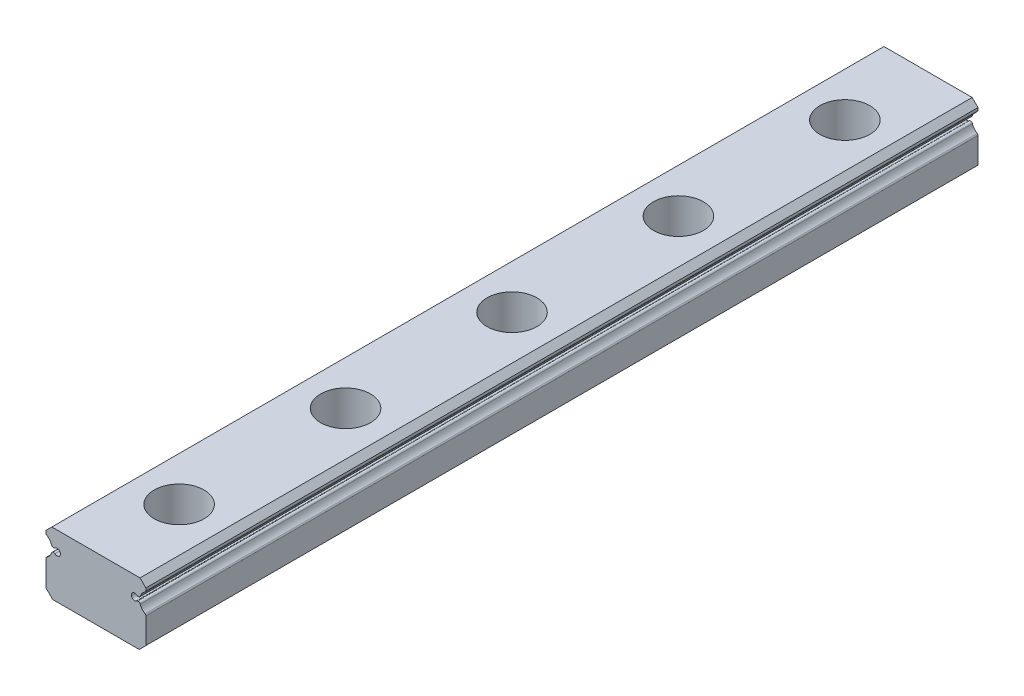
ISO-10303-21;
HEADER;
FILE_DESCRIPTION(('STEP AP214'),'2;1');
FILE_NAME('part.step','',(''),(''),'','','');
FILE_SCHEMA(('AUTOMOTIVE_DESIGN { 1 0 10303 214 1 1 1 1 }'));
ENDSEC;
DATA;
#1=APPLICATION_CONTEXT('core data for automotive mechanical design processes');
#2=APPLICATION_PROTOCOL_DEFINITION('international standard','automotive_design',2000,#1);
#3=PRODUCT_CONTEXT('',#1,'mechanical');
#4=PRODUCT('Part','Part','',(#3));
#5=PRODUCT_RELATED_PRODUCT_CATEGORY('part','',(#4));
#6=PRODUCT_DEFINITION_FORMATION('','',#4);
#7=PRODUCT_DEFINITION_CONTEXT('part definition',#1,'design');
#8=PRODUCT_DEFINITION('design','',#6,#7);
#9=PRODUCT_DEFINITION_SHAPE('','',#8);
#10=(LENGTH_UNIT() NAMED_UNIT(*) SI_UNIT(.MILLI.,.METRE.));
#11=(NAMED_UNIT(*) PLANE_ANGLE_UNIT() SI_UNIT($,.RADIAN.));
#12=(NAMED_UNIT(*) SI_UNIT($,.STERADIAN.) SOLID_ANGLE_UNIT());
#13=UNCERTAINTY_MEASURE_WITH_UNIT(LENGTH_MEASURE(1.E-05),#10,'distance_accuracy_value','');
#14=(GEOMETRIC_REPRESENTATION_CONTEXT(3) GLOBAL_UNCERTAINTY_ASSIGNED_CONTEXT((#13)) GLOBAL_UNIT_ASSIGNED_CONTEXT((#10,
#11,#12)) REPRESENTATION_CONTEXT('',''));
#15=CARTESIAN_POINT('',(0.,0.,0.));
#16=DIRECTION('',(0.,0.,1.));
#17=DIRECTION('',(1.,0.,0.));
#18=AXIS2_PLACEMENT_3D('',#15,#16,#17);
#19=CARTESIAN_POINT('',(-6.,0.,100.));
#20=DIRECTION('',(0.,-1.,0.));
#21=DIRECTION('',(0.,0.,-1.));
#22=AXIS2_PLACEMENT_3D('',#19,#20,#21);
#23=PLANE('',#22);
#24=CARTESIAN_POINT('',(0.,0.,90.));
#25=DIRECTION('',(0.,1.,0.));
#26=DIRECTION('',(0.,0.,1.));
#27=AXIS2_PLACEMENT_3D('',#24,#25,#26);
#28=CIRCLE('',#27,3.);
#29=CARTESIAN_POINT('',(0.,0.,93.));
#30=VERTEX_POINT('',#29);
#31=EDGE_CURVE('E599',#30,#30,#28,.T.);
#32=ORIENTED_EDGE('',*,*,#31,.F.);
#33=EDGE_LOOP('',(#32));
#34=FACE_BOUND('',#33,.T.);
#35=CARTESIAN_POINT('',(0.,0.,50.));
#36=DIRECTION('',(0.,1.,0.));
#37=DIRECTION('',(0.,0.,1.));
#38=AXIS2_PLACEMENT_3D('',#35,#36,#37);
#39=CIRCLE('',#38,3.);
#40=CARTESIAN_POINT('',(0.,0.,53.));
#41=VERTEX_POINT('',#40);
#42=EDGE_CURVE('E621',#41,#41,#39,.T.);
#43=ORIENTED_EDGE('',*,*,#42,.F.);
#44=EDGE_LOOP('',(#43));
#45=FACE_BOUND('',#44,.T.);
#46=CARTESIAN_POINT('',(0.,0.,30.));
#47=DIRECTION('',(0.,1.,0.));
#48=DIRECTION('',(0.,0.,1.));
#49=AXIS2_PLACEMENT_3D('',#46,#47,#48);
#50=CIRCLE('',#49,3.);
#51=CARTESIAN_POINT('',(0.,0.,33.));
#52=VERTEX_POINT('',#51);
#53=EDGE_CURVE('E633',#52,#52,#50,.T.);
#54=ORIENTED_EDGE('',*,*,#53,.F.);
#55=EDGE_LOOP('',(#54));
#56=FACE_BOUND('',#55,.T.);
#57=CARTESIAN_POINT('',(0.,0.,10.));
#58=DIRECTION('',(0.,1.,0.));
#59=DIRECTION('',(0.,0.,1.));
#60=AXIS2_PLACEMENT_3D('',#57,#58,#59);
#61=CIRCLE('',#60,3.);
#62=CARTESIAN_POINT('',(0.,0.,13.));
#63=VERTEX_POINT('',#62);
#64=EDGE_CURVE('E645',#63,#63,#61,.T.);
#65=ORIENTED_EDGE('',*,*,#64,.F.);
#66=EDGE_LOOP('',(#65));
#67=FACE_BOUND('',#66,.T.);
#68=DIRECTION('',(-1.,0.,0.));
#69=VECTOR('',#68,1.);
#70=CARTESIAN_POINT('',(-6.,0.,100.));
#71=LINE('',#70,#69);
#72=CARTESIAN_POINT('',(5.29999999999998,0.,100.));
#73=VERTEX_POINT('',#72);
#74=CARTESIAN_POINT('',(-5.29999999999999,0.,100.));
#75=VERTEX_POINT('',#74);
#76=EDGE_CURVE('E297',#73,#75,#71,.T.);
#77=ORIENTED_EDGE('',*,*,#76,.F.);
#78=DIRECTION('',(0.,0.,-1.));
#79=VECTOR('',#78,1.);
#80=CARTESIAN_POINT('',(5.29999999999998,0.,100.));
#81=LINE('',#80,#79);
#82=CARTESIAN_POINT('',(5.29999999999998,0.,0.));
#83=VERTEX_POINT('',#82);
#84=EDGE_CURVE('E359',#73,#83,#81,.T.);
#85=ORIENTED_EDGE('',*,*,#84,.T.);
#86=DIRECTION('',(-1.,0.,0.));
#87=VECTOR('',#86,1.);
#88=CARTESIAN_POINT('',(-6.,0.,0.));
#89=LINE('',#88,#87);
#90=CARTESIAN_POINT('',(-5.29999999999999,0.,0.));
#91=VERTEX_POINT('',#90);
#92=EDGE_CURVE('E309',#83,#91,#89,.T.);
#93=ORIENTED_EDGE('',*,*,#92,.T.);
#94=DIRECTION('',(0.,0.,1.));
#95=VECTOR('',#94,1.);
#96=CARTESIAN_POINT('',(-5.29999999999999,0.,100.));
#97=LINE('',#96,#95);
#98=EDGE_CURVE('E357',#91,#75,#97,.T.);
#99=ORIENTED_EDGE('',*,*,#98,.T.);
#100=EDGE_LOOP('',(#77,#85,#93,#99));
#101=FACE_BOUND('',#100,.T.);
#102=CARTESIAN_POINT('',(0.,0.,70.));
#103=DIRECTION('',(0.,1.,0.));
#104=DIRECTION('',(0.,0.,1.));
#105=AXIS2_PLACEMENT_3D('',#102,#103,#104);
#106=CIRCLE('',#105,3.);
#107=CARTESIAN_POINT('',(0.,0.,73.));
#108=VERTEX_POINT('',#107);
#109=EDGE_CURVE('E609',#108,#108,#106,.T.);
#110=ORIENTED_EDGE('',*,*,#109,.F.);
#111=EDGE_LOOP('',(#110));
#112=FACE_BOUND('',#111,.T.);
#113=ADVANCED_FACE('F47',(#34,#45,#56,#67,#101,#112),#23,.F.);
#114=CARTESIAN_POINT('',(6.,-7.5,100.));
#115=DIRECTION('',(-1.,0.,0.));
#116=DIRECTION('',(0.,0.,1.));
#117=AXIS2_PLACEMENT_3D('',#114,#115,#116);
#118=PLANE('',#117);
#119=DIRECTION('',(0.,1.,0.));
#120=VECTOR('',#119,1.);
#121=CARTESIAN_POINT('',(6.,-7.5,0.));
#122=LINE('',#121,#120);
#123=CARTESIAN_POINT('',(6.,-0.994607170235718,0.));
#124=VERTEX_POINT('',#123);
#125=CARTESIAN_POINT('',(6.,-0.70000000000002,0.));
#126=VERTEX_POINT('',#125);
#127=EDGE_CURVE('E294',#124,#126,#122,.T.);
#128=ORIENTED_EDGE('',*,*,#127,.T.);
#129=DIRECTION('',(0.,0.,1.));
#130=VECTOR('',#129,1.);
#131=CARTESIAN_POINT('',(6.,-0.70000000000002,100.));
#132=LINE('',#131,#130);
#133=CARTESIAN_POINT('',(6.,-0.70000000000002,100.));
#134=VERTEX_POINT('',#133);
#135=EDGE_CURVE('E366',#126,#134,#132,.T.);
#136=ORIENTED_EDGE('',*,*,#135,.T.);
#137=DIRECTION('',(0.,1.,0.));
#138=VECTOR('',#137,1.);
#139=CARTESIAN_POINT('',(6.,-7.5,100.));
#140=LINE('',#139,#138);
#141=CARTESIAN_POINT('',(6.,-0.994607170235718,100.));
#142=VERTEX_POINT('',#141);
#143=EDGE_CURVE('E298',#142,#134,#140,.T.);
#144=ORIENTED_EDGE('',*,*,#143,.F.);
#145=DIRECTION('',(0.,0.,-1.));
#146=VECTOR('',#145,1.);
#147=CARTESIAN_POINT('',(6.,-0.994607170235718,100.));
#148=LINE('',#147,#146);
#149=EDGE_CURVE('E341',#142,#124,#148,.T.);
#150=ORIENTED_EDGE('',*,*,#149,.T.);
#151=EDGE_LOOP('',(#128,#136,#144,#150));
#152=FACE_BOUND('',#151,.T.);
#153=ADVANCED_FACE('F460',(#152),#118,.F.);
#154=CARTESIAN_POINT('',(-6.,-7.5,100.));
#155=DIRECTION('',(1.,0.,0.));
#156=DIRECTION('',(0.,0.,-1.));
#157=AXIS2_PLACEMENT_3D('',#154,#155,#156);
#158=PLANE('',#157);
#159=DIRECTION('',(0.,-1.,0.));
#160=VECTOR('',#159,1.);
#161=CARTESIAN_POINT('',(-6.,-7.5,0.));
#162=LINE('',#161,#160);
#163=CARTESIAN_POINT('',(-6.,-3.60539282976428,0.));
#164=VERTEX_POINT('',#163);
#165=CARTESIAN_POINT('',(-6.,-6.69999999999999,0.));
#166=VERTEX_POINT('',#165);
#167=EDGE_CURVE('E312',#164,#166,#162,.T.);
#168=ORIENTED_EDGE('',*,*,#167,.T.);
#169=DIRECTION('',(0.,0.,1.));
#170=VECTOR('',#169,1.);
#171=CARTESIAN_POINT('',(-6.,-6.69999999999999,100.));
#172=LINE('',#171,#170);
#173=CARTESIAN_POINT('',(-6.,-6.69999999999999,100.));
#174=VERTEX_POINT('',#173);
#175=EDGE_CURVE('E11',#166,#174,#172,.T.);
#176=ORIENTED_EDGE('',*,*,#175,.T.);
#177=DIRECTION('',(0.,-1.,0.));
#178=VECTOR('',#177,1.);
#179=CARTESIAN_POINT('',(-6.,-7.5,100.));
#180=LINE('',#179,#178);
#181=CARTESIAN_POINT('',(-6.,-3.60539282976428,100.));
#182=VERTEX_POINT('',#181);
#183=EDGE_CURVE('E301',#182,#174,#180,.T.);
#184=ORIENTED_EDGE('',*,*,#183,.F.);
#185=DIRECTION('',(0.,0.,1.));
#186=VECTOR('',#185,1.);
#187=CARTESIAN_POINT('',(-6.,-3.60539282976428,0.));
#188=LINE('',#187,#186);
#189=EDGE_CURVE('E355',#182,#164,#188,.F.);
#190=ORIENTED_EDGE('',*,*,#189,.T.);
#191=EDGE_LOOP('',(#168,#176,#184,#190));
#192=FACE_BOUND('',#191,.T.);
#193=ADVANCED_FACE('F405',(#192),#158,.F.);
#194=CARTESIAN_POINT('',(-6.,-0.700000000000006,100.));
#195=VERTEX_POINT('',#194);
#196=CARTESIAN_POINT('',(-6.,-0.994607170235718,100.));
#197=VERTEX_POINT('',#196);
#198=EDGE_CURVE('E302',#195,#197,#180,.T.);
#199=ORIENTED_EDGE('',*,*,#198,.F.);
#200=DIRECTION('',(0.,0.,-1.));
#201=VECTOR('',#200,1.);
#202=CARTESIAN_POINT('',(-6.,-0.700000000000006,100.));
#203=LINE('',#202,#201);
#204=CARTESIAN_POINT('',(-6.,-0.700000000000006,0.));
#205=VERTEX_POINT('',#204);
#206=EDGE_CURVE('E372',#195,#205,#203,.T.);
#207=ORIENTED_EDGE('',*,*,#206,.T.);
#208=CARTESIAN_POINT('',(-6.,-0.994607170235718,0.));
#209=VERTEX_POINT('',#208);
#210=EDGE_CURVE('E313',#205,#209,#162,.T.);
#211=ORIENTED_EDGE('',*,*,#210,.T.);
#212=DIRECTION('',(0.,0.,1.));
#213=VECTOR('',#212,1.);
#214=CARTESIAN_POINT('',(-6.,-0.994607170235718,100.));
#215=LINE('',#214,#213);
#216=EDGE_CURVE('E349',#209,#197,#215,.T.);
#217=ORIENTED_EDGE('',*,*,#216,.T.);
#218=EDGE_LOOP('',(#199,#207,#211,#217));
#219=FACE_BOUND('',#218,.T.);
#220=ADVANCED_FACE('F441',(#219),#158,.F.);
#221=CARTESIAN_POINT('',(6.,-6.69999999999999,100.));
#222=VERTEX_POINT('',#221);
#223=CARTESIAN_POINT('',(6.,-3.60539282976428,100.));
#224=VERTEX_POINT('',#223);
#225=EDGE_CURVE('E295',#222,#224,#140,.T.);
#226=ORIENTED_EDGE('',*,*,#225,.F.);
#227=DIRECTION('',(0.,0.,-1.));
#228=VECTOR('',#227,1.);
#229=CARTESIAN_POINT('',(6.,-6.69999999999999,100.));
#230=LINE('',#229,#228);
#231=CARTESIAN_POINT('',(6.,-6.69999999999999,0.));
#232=VERTEX_POINT('',#231);
#233=EDGE_CURVE('E375',#222,#232,#230,.T.);
#234=ORIENTED_EDGE('',*,*,#233,.T.);
#235=CARTESIAN_POINT('',(6.,-3.60539282976428,0.));
#236=VERTEX_POINT('',#235);
#237=EDGE_CURVE('E307',#232,#236,#122,.T.);
#238=ORIENTED_EDGE('',*,*,#237,.T.);
#239=DIRECTION('',(0.,0.,-1.));
#240=VECTOR('',#239,1.);
#241=CARTESIAN_POINT('',(6.,-3.60539282976428,100.));
#242=LINE('',#241,#240);
#243=EDGE_CURVE('E319',#236,#224,#242,.F.);
#244=ORIENTED_EDGE('',*,*,#243,.T.);
#245=EDGE_LOOP('',(#226,#234,#238,#244));
#246=FACE_BOUND('',#245,.T.);
#247=ADVANCED_FACE('F392',(#246),#118,.F.);
#248=CARTESIAN_POINT('',(-6.,-7.5,100.));
#249=DIRECTION('',(0.,1.,0.));
#250=DIRECTION('',(0.,0.,1.));
#251=AXIS2_PLACEMENT_3D('',#248,#249,#250);
#252=PLANE('',#251);
#253=CARTESIAN_POINT('',(0.,-7.5,90.));
#254=DIRECTION('',(0.,1.,0.));
#255=DIRECTION('',(0.,0.,1.));
#256=AXIS2_PLACEMENT_3D('',#253,#254,#255);
#257=CIRCLE('',#256,1.75);
#258=CARTESIAN_POINT('',(0.,-7.5,91.75));
#259=VERTEX_POINT('',#258);
#260=EDGE_CURVE('E606',#259,#259,#257,.T.);
#261=ORIENTED_EDGE('',*,*,#260,.T.);
#262=EDGE_LOOP('',(#261));
#263=FACE_BOUND('',#262,.T.);
#264=CARTESIAN_POINT('',(0.,-7.5,70.));
#265=DIRECTION('',(0.,1.,0.));
#266=DIRECTION('',(0.,0.,1.));
#267=AXIS2_PLACEMENT_3D('',#264,#265,#266);
#268=CIRCLE('',#267,1.75);
#269=CARTESIAN_POINT('',(0.,-7.5,71.75));
#270=VERTEX_POINT('',#269);
#271=EDGE_CURVE('E618',#270,#270,#268,.T.);
#272=ORIENTED_EDGE('',*,*,#271,.T.);
#273=EDGE_LOOP('',(#272));
#274=FACE_BOUND('',#273,.T.);
#275=CARTESIAN_POINT('',(0.,-7.5,50.));
#276=DIRECTION('',(0.,1.,0.));
#277=DIRECTION('',(0.,0.,1.));
#278=AXIS2_PLACEMENT_3D('',#275,#276,#277);
#279=CIRCLE('',#278,1.75);
#280=CARTESIAN_POINT('',(0.,-7.5,51.75));
#281=VERTEX_POINT('',#280);
#282=EDGE_CURVE('E630',#281,#281,#279,.T.);
#283=ORIENTED_EDGE('',*,*,#282,.T.);
#284=EDGE_LOOP('',(#283));
#285=FACE_BOUND('',#284,.T.);
#286=CARTESIAN_POINT('',(0.,-7.5,30.));
#287=DIRECTION('',(0.,1.,0.));
#288=DIRECTION('',(0.,0.,1.));
#289=AXIS2_PLACEMENT_3D('',#286,#287,#288);
#290=CIRCLE('',#289,1.75);
#291=CARTESIAN_POINT('',(0.,-7.5,31.75));
#292=VERTEX_POINT('',#291);
#293=EDGE_CURVE('E642',#292,#292,#290,.T.);
#294=ORIENTED_EDGE('',*,*,#293,.T.);
#295=EDGE_LOOP('',(#294));
#296=FACE_BOUND('',#295,.T.);
#297=CARTESIAN_POINT('',(0.,-7.5,10.));
#298=DIRECTION('',(0.,1.,0.));
#299=DIRECTION('',(0.,0.,1.));
#300=AXIS2_PLACEMENT_3D('',#297,#298,#299);
#301=CIRCLE('',#300,1.75);
#302=CARTESIAN_POINT('',(0.,-7.5,11.75));
#303=VERTEX_POINT('',#302);
#304=EDGE_CURVE('E243',#303,#303,#301,.T.);
#305=ORIENTED_EDGE('',*,*,#304,.T.);
#306=EDGE_LOOP('',(#305));
#307=FACE_BOUND('',#306,.T.);
#308=DIRECTION('',(1.,0.,0.));
#309=VECTOR('',#308,1.);
#310=CARTESIAN_POINT('',(-6.,-7.5,0.));
#311=LINE('',#310,#309);
#312=CARTESIAN_POINT('',(-5.19999999999999,-7.5,0.));
#313=VERTEX_POINT('',#312);
#314=CARTESIAN_POINT('',(5.19999999999999,-7.5,0.));
#315=VERTEX_POINT('',#314);
#316=EDGE_CURVE('E315',#313,#315,#311,.T.);
#317=ORIENTED_EDGE('',*,*,#316,.T.);
#318=DIRECTION('',(0.,0.,1.));
#319=VECTOR('',#318,1.);
#320=CARTESIAN_POINT('',(5.19999999999999,-7.5,100.));
#321=LINE('',#320,#319);
#322=CARTESIAN_POINT('',(5.19999999999999,-7.5,100.));
#323=VERTEX_POINT('',#322);
#324=EDGE_CURVE('E69',#315,#323,#321,.T.);
#325=ORIENTED_EDGE('',*,*,#324,.T.);
#326=DIRECTION('',(1.,0.,0.));
#327=VECTOR('',#326,1.);
#328=CARTESIAN_POINT('',(-6.,-7.5,100.));
#329=LINE('',#328,#327);
#330=CARTESIAN_POINT('',(-5.19999999999999,-7.5,100.));
#331=VERTEX_POINT('',#330);
#332=EDGE_CURVE('E304',#331,#323,#329,.T.);
#333=ORIENTED_EDGE('',*,*,#332,.F.);
#334=DIRECTION('',(0.,0.,-1.));
#335=VECTOR('',#334,1.);
#336=CARTESIAN_POINT('',(-5.19999999999999,-7.5,100.));
#337=LINE('',#336,#335);
#338=EDGE_CURVE('E382',#331,#313,#337,.T.);
#339=ORIENTED_EDGE('',*,*,#338,.T.);
#340=EDGE_LOOP('',(#317,#325,#333,#339));
#341=FACE_BOUND('',#340,.T.);
#342=ADVANCED_FACE('F399',(#263,#274,#285,#296,#307,#341),#252,.F.);
#343=CARTESIAN_POINT('',(0.,0.,100.));
#344=DIRECTION('',(0.,0.,-1.));
#345=DIRECTION('',(-1.,0.,0.));
#346=AXIS2_PLACEMENT_3D('',#343,#344,#345);
#347=PLANE('',#346);
#348=ORIENTED_EDGE('',*,*,#332,.T.);
#349=DIRECTION('',(-0.707106781186548,-0.707106781186548,0.));
#350=VECTOR('',#349,1.);
#351=CARTESIAN_POINT('',(6.,-6.69999999999999,100.));
#352=LINE('',#351,#350);
#353=EDGE_CURVE('E56',#323,#222,#352,.F.);
#354=ORIENTED_EDGE('',*,*,#353,.T.);
#355=ORIENTED_EDGE('',*,*,#225,.T.);
#356=CARTESIAN_POINT('',(5.8,-3.60539282976428,100.));
#357=DIRECTION('',(0.,0.,-1.));
#358=DIRECTION('',(-1.,0.,0.));
#359=AXIS2_PLACEMENT_3D('',#356,#357,#358);
#360=CIRCLE('',#359,0.2);
#361=CARTESIAN_POINT('',(5.90339672131148,-3.43419377012306,100.));
#362=VERTEX_POINT('',#361);
#363=EDGE_CURVE('E218',#224,#362,#360,.F.);
#364=ORIENTED_EDGE('',*,*,#363,.T.);
#365=CARTESIAN_POINT('',(6.5884,-2.3,100.));
#366=DIRECTION('',(0.,0.,-1.));
#367=DIRECTION('',(-1.,0.,0.));
#368=AXIS2_PLACEMENT_3D('',#365,#366,#367);
#369=CIRCLE('',#368,1.325);
#370=CARTESIAN_POINT('',(5.32925240224404,-2.71251948689171,100.));
#371=VERTEX_POINT('',#370);
#372=EDGE_CURVE('E211',#362,#371,#369,.T.);
#373=ORIENTED_EDGE('',*,*,#372,.T.);
#374=CARTESIAN_POINT('',(5.09167738379952,-2.79035335234298,100.));
#375=DIRECTION('',(0.,0.,1.));
#376=DIRECTION('',(-1.,0.,0.));
#377=AXIS2_PLACEMENT_3D('',#374,#375,#376);
#378=CIRCLE('',#377,0.25);
#379=CARTESIAN_POINT('',(4.92757069772278,-2.60175590913414,100.));
#380=VERTEX_POINT('',#379);
#381=EDGE_CURVE('E216',#371,#380,#378,.T.);
#382=ORIENTED_EDGE('',*,*,#381,.T.);
#383=CARTESIAN_POINT('',(4.665,-2.3,100.));
#384=DIRECTION('',(0.,0.,-1.));
#385=DIRECTION('',(1.,0.,0.));
#386=AXIS2_PLACEMENT_3D('',#383,#384,#385);
#387=CIRCLE('',#386,0.4);
#388=CARTESIAN_POINT('',(4.92757069772278,-1.99824409086586,100.));
#389=VERTEX_POINT('',#388);
#390=EDGE_CURVE('E250',#380,#389,#387,.T.);
#391=ORIENTED_EDGE('',*,*,#390,.T.);
#392=CARTESIAN_POINT('',(5.09167738379952,-1.80964664765702,100.));
#393=DIRECTION('',(0.,0.,1.));
#394=DIRECTION('',(1.,0.,0.));
#395=AXIS2_PLACEMENT_3D('',#392,#393,#394);
#396=CIRCLE('',#395,0.25);
#397=CARTESIAN_POINT('',(5.32925240224404,-1.88748051310829,100.));
#398=VERTEX_POINT('',#397);
#399=EDGE_CURVE('E247',#389,#398,#396,.T.);
#400=ORIENTED_EDGE('',*,*,#399,.T.);
#401=CARTESIAN_POINT('',(5.90339672131148,-1.16580622987694,100.));
#402=VERTEX_POINT('',#401);
#403=EDGE_CURVE('E221',#398,#402,#369,.T.);
#404=ORIENTED_EDGE('',*,*,#403,.T.);
#405=CARTESIAN_POINT('',(5.8,-0.994607170235718,100.));
#406=DIRECTION('',(0.,0.,-1.));
#407=DIRECTION('',(-1.,0.,0.));
#408=AXIS2_PLACEMENT_3D('',#405,#406,#407);
#409=CIRCLE('',#408,0.2);
#410=EDGE_CURVE('E326',#402,#142,#409,.F.);
#411=ORIENTED_EDGE('',*,*,#410,.T.);
#412=ORIENTED_EDGE('',*,*,#143,.T.);
#413=DIRECTION('',(0.707106781186548,-0.707106781186548,0.));
#414=VECTOR('',#413,1.);
#415=CARTESIAN_POINT('',(5.29999999999998,0.,100.));
#416=LINE('',#415,#414);
#417=EDGE_CURVE('E370',#134,#73,#416,.F.);
#418=ORIENTED_EDGE('',*,*,#417,.T.);
#419=ORIENTED_EDGE('',*,*,#76,.T.);
#420=DIRECTION('',(0.707106781186548,0.707106781186548,0.));
#421=VECTOR('',#420,1.);
#422=CARTESIAN_POINT('',(-6.,-0.700000000000006,100.));
#423=LINE('',#422,#421);
#424=EDGE_CURVE('E368',#75,#195,#423,.F.);
#425=ORIENTED_EDGE('',*,*,#424,.T.);
#426=ORIENTED_EDGE('',*,*,#198,.T.);
#427=CARTESIAN_POINT('',(-5.8,-0.994607170235718,100.));
#428=DIRECTION('',(0.,0.,-1.));
#429=DIRECTION('',(-1.,0.,0.));
#430=AXIS2_PLACEMENT_3D('',#427,#428,#429);
#431=CIRCLE('',#430,0.2);
#432=CARTESIAN_POINT('',(-5.90339672131148,-1.16580622987694,100.));
#433=VERTEX_POINT('',#432);
#434=EDGE_CURVE('E324',#197,#433,#431,.F.);
#435=ORIENTED_EDGE('',*,*,#434,.T.);
#436=CARTESIAN_POINT('',(-6.5884,-2.3,100.));
#437=DIRECTION('',(0.,0.,1.));
#438=DIRECTION('',(1.,0.,0.));
#439=AXIS2_PLACEMENT_3D('',#436,#437,#438);
#440=CIRCLE('',#439,1.325);
#441=CARTESIAN_POINT('',(-5.32925240224404,-1.88748051310829,100.));
#442=VERTEX_POINT('',#441);
#443=EDGE_CURVE('E271',#442,#433,#440,.T.);
#444=ORIENTED_EDGE('',*,*,#443,.F.);
#445=CARTESIAN_POINT('',(-5.09167738379952,-1.80964664765702,100.));
#446=DIRECTION('',(0.,0.,-1.));
#447=DIRECTION('',(-1.,0.,0.));
#448=AXIS2_PLACEMENT_3D('',#445,#446,#447);
#449=CIRCLE('',#448,0.25);
#450=CARTESIAN_POINT('',(-4.92757069772278,-1.99824409086586,100.));
#451=VERTEX_POINT('',#450);
#452=EDGE_CURVE('E268',#451,#442,#449,.T.);
#453=ORIENTED_EDGE('',*,*,#452,.F.);
#454=CARTESIAN_POINT('',(-4.665,-2.3,100.));
#455=DIRECTION('',(0.,0.,1.));
#456=DIRECTION('',(-1.,0.,0.));
#457=AXIS2_PLACEMENT_3D('',#454,#455,#456);
#458=CIRCLE('',#457,0.4);
#459=CARTESIAN_POINT('',(-4.92757069772278,-2.60175590913414,100.));
#460=VERTEX_POINT('',#459);
#461=EDGE_CURVE('E265',#460,#451,#458,.T.);
#462=ORIENTED_EDGE('',*,*,#461,.F.);
#463=CARTESIAN_POINT('',(-5.09167738379952,-2.79035335234298,100.));
#464=DIRECTION('',(0.,0.,-1.));
#465=DIRECTION('',(1.,0.,0.));
#466=AXIS2_PLACEMENT_3D('',#463,#464,#465);
#467=CIRCLE('',#466,0.25);
#468=CARTESIAN_POINT('',(-5.32925240224404,-2.71251948689171,100.));
#469=VERTEX_POINT('',#468);
#470=EDGE_CURVE('E263',#469,#460,#467,.T.);
#471=ORIENTED_EDGE('',*,*,#470,.F.);
#472=CARTESIAN_POINT('',(-5.90339672131148,-3.43419377012306,100.));
#473=VERTEX_POINT('',#472);
#474=EDGE_CURVE('E270',#473,#469,#440,.T.);
#475=ORIENTED_EDGE('',*,*,#474,.F.);
#476=CARTESIAN_POINT('',(-5.8,-3.60539282976428,100.));
#477=DIRECTION('',(0.,0.,-1.));
#478=DIRECTION('',(-1.,0.,0.));
#479=AXIS2_PLACEMENT_3D('',#476,#477,#478);
#480=CIRCLE('',#479,0.2);
#481=EDGE_CURVE('E322',#473,#182,#480,.F.);
#482=ORIENTED_EDGE('',*,*,#481,.T.);
#483=ORIENTED_EDGE('',*,*,#183,.T.);
#484=DIRECTION('',(-0.707106781186548,0.707106781186548,0.));
#485=VECTOR('',#484,1.);
#486=CARTESIAN_POINT('',(-5.19999999999999,-7.5,100.));
#487=LINE('',#486,#485);
#488=EDGE_CURVE('E386',#174,#331,#487,.F.);
#489=ORIENTED_EDGE('',*,*,#488,.T.);
#490=EDGE_LOOP('',(#348,#354,#355,#364,#373,#382,#391,#400,#404,#411,#412,#418,#419,#425,#426,
#435,#444,#453,#462,#471,#475,#482,#483,#489));
#491=FACE_BOUND('',#490,.T.);
#492=ADVANCED_FACE('F213',(#491),#347,.F.);
#493=CARTESIAN_POINT('',(0.,0.,0.));
#494=DIRECTION('',(0.,0.,-1.));
#495=DIRECTION('',(-1.,0.,0.));
#496=AXIS2_PLACEMENT_3D('',#493,#494,#495);
#497=PLANE('',#496);
#498=ORIENTED_EDGE('',*,*,#237,.F.);
#499=DIRECTION('',(0.707106781186548,0.707106781186548,0.));
#500=VECTOR('',#499,1.);
#501=CARTESIAN_POINT('',(6.35,-6.35,0.));
#502=LINE('',#501,#500);
#503=EDGE_CURVE('E380',#232,#315,#502,.F.);
#504=ORIENTED_EDGE('',*,*,#503,.T.);
#505=ORIENTED_EDGE('',*,*,#316,.F.);
#506=DIRECTION('',(0.707106781186548,-0.707106781186548,0.));
#507=VECTOR('',#506,1.);
#508=CARTESIAN_POINT('',(-6.35,-6.35,0.));
#509=LINE('',#508,#507);
#510=EDGE_CURVE('E378',#313,#166,#509,.F.);
#511=ORIENTED_EDGE('',*,*,#510,.T.);
#512=ORIENTED_EDGE('',*,*,#167,.F.);
#513=CARTESIAN_POINT('',(-5.8,-3.60539282976428,0.));
#514=DIRECTION('',(0.,0.,-1.));
#515=DIRECTION('',(-1.,0.,0.));
#516=AXIS2_PLACEMENT_3D('',#513,#514,#515);
#517=CIRCLE('',#516,0.2);
#518=CARTESIAN_POINT('',(-5.90339672131148,-3.43419377012306,0.));
#519=VERTEX_POINT('',#518);
#520=EDGE_CURVE('E331',#164,#519,#517,.T.);
#521=ORIENTED_EDGE('',*,*,#520,.T.);
#522=CARTESIAN_POINT('',(-6.5884,-2.3,0.));
#523=DIRECTION('',(0.,0.,-1.));
#524=DIRECTION('',(-1.,0.,0.));
#525=AXIS2_PLACEMENT_3D('',#522,#523,#524);
#526=CIRCLE('',#525,1.325);
#527=CARTESIAN_POINT('',(-5.32925240224404,-2.71251948689171,0.));
#528=VERTEX_POINT('',#527);
#529=EDGE_CURVE('E306',#519,#528,#526,.F.);
#530=ORIENTED_EDGE('',*,*,#529,.T.);
#531=CARTESIAN_POINT('',(-5.09167738379952,-2.79035335234298,0.));
#532=DIRECTION('',(0.,0.,-1.));
#533=DIRECTION('',(1.,0.,0.));
#534=AXIS2_PLACEMENT_3D('',#531,#532,#533);
#535=CIRCLE('',#534,0.25);
#536=CARTESIAN_POINT('',(-4.92757069772278,-2.60175590913414,0.));
#537=VERTEX_POINT('',#536);
#538=EDGE_CURVE('E230',#528,#537,#535,.T.);
#539=ORIENTED_EDGE('',*,*,#538,.T.);
#540=CARTESIAN_POINT('',(-4.665,-2.3,0.));
#541=DIRECTION('',(0.,0.,1.));
#542=DIRECTION('',(-1.,0.,0.));
#543=AXIS2_PLACEMENT_3D('',#540,#541,#542);
#544=CIRCLE('',#543,0.4);
#545=CARTESIAN_POINT('',(-4.92757069772278,-1.99824409086586,0.));
#546=VERTEX_POINT('',#545);
#547=EDGE_CURVE('E277',#537,#546,#544,.T.);
#548=ORIENTED_EDGE('',*,*,#547,.T.);
#549=CARTESIAN_POINT('',(-5.09167738379952,-1.80964664765702,0.));
#550=DIRECTION('',(0.,0.,-1.));
#551=DIRECTION('',(-1.,0.,0.));
#552=AXIS2_PLACEMENT_3D('',#549,#550,#551);
#553=CIRCLE('',#552,0.25);
#554=CARTESIAN_POINT('',(-5.32925240224404,-1.88748051310829,0.));
#555=VERTEX_POINT('',#554);
#556=EDGE_CURVE('E280',#546,#555,#553,.T.);
#557=ORIENTED_EDGE('',*,*,#556,.T.);
#558=CARTESIAN_POINT('',(-6.5884,-2.3,0.));
#559=DIRECTION('',(0.,0.,1.));
#560=DIRECTION('',(1.,0.,0.));
#561=AXIS2_PLACEMENT_3D('',#558,#559,#560);
#562=CIRCLE('',#561,1.325);
#563=CARTESIAN_POINT('',(-5.90339672131148,-1.16580622987694,0.));
#564=VERTEX_POINT('',#563);
#565=EDGE_CURVE('E266',#555,#564,#562,.T.);
#566=ORIENTED_EDGE('',*,*,#565,.T.);
#567=CARTESIAN_POINT('',(-5.8,-0.994607170235718,0.));
#568=DIRECTION('',(0.,0.,-1.));
#569=DIRECTION('',(-1.,0.,0.));
#570=AXIS2_PLACEMENT_3D('',#567,#568,#569);
#571=CIRCLE('',#570,0.2);
#572=EDGE_CURVE('E333',#564,#209,#571,.T.);
#573=ORIENTED_EDGE('',*,*,#572,.T.);
#574=ORIENTED_EDGE('',*,*,#210,.F.);
#575=DIRECTION('',(-0.707106781186548,-0.707106781186548,0.));
#576=VECTOR('',#575,1.);
#577=CARTESIAN_POINT('',(-2.65,2.65,0.));
#578=LINE('',#577,#576);
#579=EDGE_CURVE('E362',#205,#91,#578,.F.);
#580=ORIENTED_EDGE('',*,*,#579,.T.);
#581=ORIENTED_EDGE('',*,*,#92,.F.);
#582=DIRECTION('',(-0.707106781186548,0.707106781186548,0.));
#583=VECTOR('',#582,1.);
#584=CARTESIAN_POINT('',(2.64999999999999,2.64999999999999,0.));
#585=LINE('',#584,#583);
#586=EDGE_CURVE('E364',#83,#126,#585,.F.);
#587=ORIENTED_EDGE('',*,*,#586,.T.);
#588=ORIENTED_EDGE('',*,*,#127,.F.);
#589=CARTESIAN_POINT('',(5.8,-0.994607170235718,0.));
#590=DIRECTION('',(0.,0.,-1.));
#591=DIRECTION('',(-1.,0.,0.));
#592=AXIS2_PLACEMENT_3D('',#589,#590,#591);
#593=CIRCLE('',#592,0.2);
#594=CARTESIAN_POINT('',(5.90339672131148,-1.16580622987694,0.));
#595=VERTEX_POINT('',#594);
#596=EDGE_CURVE('E336',#124,#595,#593,.T.);
#597=ORIENTED_EDGE('',*,*,#596,.T.);
#598=CARTESIAN_POINT('',(6.5884,-2.3,0.));
#599=DIRECTION('',(0.,0.,-1.));
#600=DIRECTION('',(-1.,0.,0.));
#601=AXIS2_PLACEMENT_3D('',#598,#599,#600);
#602=CIRCLE('',#601,1.325);
#603=CARTESIAN_POINT('',(5.32925240224404,-1.88748051310829,0.));
#604=VERTEX_POINT('',#603);
#605=EDGE_CURVE('E254',#604,#595,#602,.T.);
#606=ORIENTED_EDGE('',*,*,#605,.F.);
#607=CARTESIAN_POINT('',(5.09167738379952,-1.80964664765702,0.));
#608=DIRECTION('',(0.,0.,1.));
#609=DIRECTION('',(1.,0.,0.));
#610=AXIS2_PLACEMENT_3D('',#607,#608,#609);
#611=CIRCLE('',#610,0.25);
#612=CARTESIAN_POINT('',(4.92757069772278,-1.99824409086586,0.));
#613=VERTEX_POINT('',#612);
#614=EDGE_CURVE('E240',#613,#604,#611,.T.);
#615=ORIENTED_EDGE('',*,*,#614,.F.);
#616=CARTESIAN_POINT('',(4.665,-2.3,0.));
#617=DIRECTION('',(0.,0.,-1.));
#618=DIRECTION('',(1.,0.,0.));
#619=AXIS2_PLACEMENT_3D('',#616,#617,#618);
#620=CIRCLE('',#619,0.4);
#621=CARTESIAN_POINT('',(4.92757069772278,-2.60175590913414,0.));
#622=VERTEX_POINT('',#621);
#623=EDGE_CURVE('E237',#622,#613,#620,.T.);
#624=ORIENTED_EDGE('',*,*,#623,.F.);
#625=CARTESIAN_POINT('',(5.09167738379952,-2.79035335234298,0.));
#626=DIRECTION('',(0.,0.,1.));
#627=DIRECTION('',(-1.,0.,0.));
#628=AXIS2_PLACEMENT_3D('',#625,#626,#627);
#629=CIRCLE('',#628,0.25);
#630=CARTESIAN_POINT('',(5.32925240224404,-2.71251948689171,0.));
#631=VERTEX_POINT('',#630);
#632=EDGE_CURVE('E252',#631,#622,#629,.T.);
#633=ORIENTED_EDGE('',*,*,#632,.F.);
#634=CARTESIAN_POINT('',(6.5884,-2.3,0.));
#635=DIRECTION('',(0.,0.,-1.));
#636=DIRECTION('',(-1.,0.,0.));
#637=AXIS2_PLACEMENT_3D('',#634,#635,#636);
#638=CIRCLE('',#637,1.325);
#639=CARTESIAN_POINT('',(5.90339672131148,-3.43419377012306,0.));
#640=VERTEX_POINT('',#639);
#641=EDGE_CURVE('E227',#640,#631,#638,.T.);
#642=ORIENTED_EDGE('',*,*,#641,.F.);
#643=CARTESIAN_POINT('',(5.8,-3.60539282976428,0.));
#644=DIRECTION('',(0.,0.,-1.));
#645=DIRECTION('',(-1.,0.,0.));
#646=AXIS2_PLACEMENT_3D('',#643,#644,#645);
#647=CIRCLE('',#646,0.2);
#648=EDGE_CURVE('E338',#640,#236,#647,.T.);
#649=ORIENTED_EDGE('',*,*,#648,.T.);
#650=EDGE_LOOP('',(#498,#504,#505,#511,#512,#521,#530,#539,#548,#557,#566,#573,#574,#580,#581,
#587,#588,#597,#606,#615,#624,#633,#642,#649));
#651=FACE_BOUND('',#650,.T.);
#652=ADVANCED_FACE('F398',(#651),#497,.T.);
#653=CARTESIAN_POINT('',(-6.5884,-2.3,100.));
#654=DIRECTION('',(0.,0.,-1.));
#655=DIRECTION('',(-1.,0.,0.));
#656=AXIS2_PLACEMENT_3D('',#653,#654,#655);
#657=CYLINDRICAL_SURFACE('',#656,1.325);
#658=ORIENTED_EDGE('',*,*,#529,.F.);
#659=DIRECTION('',(0.,0.,-1.));
#660=VECTOR('',#659,1.);
#661=CARTESIAN_POINT('',(-5.90339672131148,-3.43419377012306,100.));
#662=LINE('',#661,#660);
#663=EDGE_CURVE('E352',#519,#473,#662,.F.);
#664=ORIENTED_EDGE('',*,*,#663,.T.);
#665=ORIENTED_EDGE('',*,*,#474,.T.);
#666=DIRECTION('',(0.,0.,-1.));
#667=VECTOR('',#666,1.);
#668=CARTESIAN_POINT('',(-5.32925240224404,-2.71251948689171,100.));
#669=LINE('',#668,#667);
#670=EDGE_CURVE('E274',#469,#528,#669,.T.);
#671=ORIENTED_EDGE('',*,*,#670,.T.);
#672=EDGE_LOOP('',(#658,#664,#665,#671));
#673=FACE_BOUND('',#672,.T.);
#674=ADVANCED_FACE('F413',(#673),#657,.F.);
#675=ORIENTED_EDGE('',*,*,#443,.T.);
#676=DIRECTION('',(0.,0.,-1.));
#677=VECTOR('',#676,1.);
#678=CARTESIAN_POINT('',(-5.90339672131148,-1.16580622987694,100.));
#679=LINE('',#678,#677);
#680=EDGE_CURVE('E346',#433,#564,#679,.T.);
#681=ORIENTED_EDGE('',*,*,#680,.T.);
#682=ORIENTED_EDGE('',*,*,#565,.F.);
#683=DIRECTION('',(0.,0.,-1.));
#684=VECTOR('',#683,1.);
#685=CARTESIAN_POINT('',(-5.32925240224404,-1.88748051310829,100.));
#686=LINE('',#685,#684);
#687=EDGE_CURVE('E287',#442,#555,#686,.T.);
#688=ORIENTED_EDGE('',*,*,#687,.F.);
#689=EDGE_LOOP('',(#675,#681,#682,#688));
#690=FACE_BOUND('',#689,.T.);
#691=ADVANCED_FACE('F434',(#690),#657,.F.);
#692=CARTESIAN_POINT('',(-5.09167738379952,-2.79035335234298,100.));
#693=DIRECTION('',(0.,0.,-1.));
#694=DIRECTION('',(-1.,0.,0.));
#695=AXIS2_PLACEMENT_3D('',#692,#693,#694);
#696=CYLINDRICAL_SURFACE('',#695,0.25);
#697=ORIENTED_EDGE('',*,*,#538,.F.);
#698=ORIENTED_EDGE('',*,*,#670,.F.);
#699=ORIENTED_EDGE('',*,*,#470,.T.);
#700=DIRECTION('',(0.,0.,-1.));
#701=VECTOR('',#700,1.);
#702=CARTESIAN_POINT('',(-4.92757069772278,-2.60175590913414,100.));
#703=LINE('',#702,#701);
#704=EDGE_CURVE('E291',#460,#537,#703,.T.);
#705=ORIENTED_EDGE('',*,*,#704,.T.);
#706=EDGE_LOOP('',(#697,#698,#699,#705));
#707=FACE_BOUND('',#706,.T.);
#708=ADVANCED_FACE('F418',(#707),#696,.T.);
#709=CARTESIAN_POINT('',(-4.665,-2.3,100.));
#710=DIRECTION('',(0.,0.,-1.));
#711=DIRECTION('',(-1.,0.,0.));
#712=AXIS2_PLACEMENT_3D('',#709,#710,#711);
#713=CYLINDRICAL_SURFACE('',#712,0.4);
#714=ORIENTED_EDGE('',*,*,#547,.F.);
#715=ORIENTED_EDGE('',*,*,#704,.F.);
#716=ORIENTED_EDGE('',*,*,#461,.T.);
#717=DIRECTION('',(0.,0.,-1.));
#718=VECTOR('',#717,1.);
#719=CARTESIAN_POINT('',(-4.92757069772278,-1.99824409086586,100.));
#720=LINE('',#719,#718);
#721=EDGE_CURVE('E289',#451,#546,#720,.T.);
#722=ORIENTED_EDGE('',*,*,#721,.T.);
#723=EDGE_LOOP('',(#714,#715,#716,#722));
#724=FACE_BOUND('',#723,.T.);
#725=ADVANCED_FACE('F425',(#724),#713,.F.);
#726=CARTESIAN_POINT('',(-5.09167738379952,-1.80964664765702,100.));
#727=DIRECTION('',(0.,0.,-1.));
#728=DIRECTION('',(-1.,0.,0.));
#729=AXIS2_PLACEMENT_3D('',#726,#727,#728);
#730=CYLINDRICAL_SURFACE('',#729,0.25);
#731=ORIENTED_EDGE('',*,*,#556,.F.);
#732=ORIENTED_EDGE('',*,*,#721,.F.);
#733=ORIENTED_EDGE('',*,*,#452,.T.);
#734=ORIENTED_EDGE('',*,*,#687,.T.);
#735=EDGE_LOOP('',(#731,#732,#733,#734));
#736=FACE_BOUND('',#735,.T.);
#737=ADVANCED_FACE('F428',(#736),#730,.T.);
#738=CARTESIAN_POINT('',(6.5884,-2.3,100.));
#739=DIRECTION('',(0.,0.,-1.));
#740=DIRECTION('',(-1.,0.,0.));
#741=AXIS2_PLACEMENT_3D('',#738,#739,#740);
#742=CYLINDRICAL_SURFACE('',#741,1.325);
#743=ORIENTED_EDGE('',*,*,#605,.T.);
#744=DIRECTION('',(0.,0.,-1.));
#745=VECTOR('',#744,1.);
#746=CARTESIAN_POINT('',(5.90339672131148,-1.16580622987694,100.));
#747=LINE('',#746,#745);
#748=EDGE_CURVE('E344',#595,#402,#747,.F.);
#749=ORIENTED_EDGE('',*,*,#748,.T.);
#750=ORIENTED_EDGE('',*,*,#403,.F.);
#751=DIRECTION('',(0.,0.,-1.));
#752=VECTOR('',#751,1.);
#753=CARTESIAN_POINT('',(5.32925240224404,-1.88748051310829,100.));
#754=LINE('',#753,#752);
#755=EDGE_CURVE('E231',#398,#604,#754,.T.);
#756=ORIENTED_EDGE('',*,*,#755,.T.);
#757=EDGE_LOOP('',(#743,#749,#750,#756));
#758=FACE_BOUND('',#757,.T.);
#759=ADVANCED_FACE('F470',(#758),#742,.F.);
#760=ORIENTED_EDGE('',*,*,#372,.F.);
#761=DIRECTION('',(0.,0.,-1.));
#762=VECTOR('',#761,1.);
#763=CARTESIAN_POINT('',(5.90339672131148,-3.43419377012306,100.));
#764=LINE('',#763,#762);
#765=EDGE_CURVE('E329',#362,#640,#764,.T.);
#766=ORIENTED_EDGE('',*,*,#765,.T.);
#767=ORIENTED_EDGE('',*,*,#641,.T.);
#768=DIRECTION('',(0.,0.,-1.));
#769=VECTOR('',#768,1.);
#770=CARTESIAN_POINT('',(5.32925240224404,-2.71251948689171,100.));
#771=LINE('',#770,#769);
#772=EDGE_CURVE('E224',#371,#631,#771,.T.);
#773=ORIENTED_EDGE('',*,*,#772,.F.);
#774=EDGE_LOOP('',(#760,#766,#767,#773));
#775=FACE_BOUND('',#774,.T.);
#776=ADVANCED_FACE('F225',(#775),#742,.F.);
#777=CARTESIAN_POINT('',(5.09167738379952,-2.79035335234298,100.));
#778=DIRECTION('',(0.,0.,-1.));
#779=DIRECTION('',(-1.,0.,0.));
#780=AXIS2_PLACEMENT_3D('',#777,#778,#779);
#781=CYLINDRICAL_SURFACE('',#780,0.25);
#782=ORIENTED_EDGE('',*,*,#632,.T.);
#783=DIRECTION('',(0.,0.,-1.));
#784=VECTOR('',#783,1.);
#785=CARTESIAN_POINT('',(4.92757069772278,-2.60175590913414,100.));
#786=LINE('',#785,#784);
#787=EDGE_CURVE('E235',#380,#622,#786,.T.);
#788=ORIENTED_EDGE('',*,*,#787,.F.);
#789=ORIENTED_EDGE('',*,*,#381,.F.);
#790=ORIENTED_EDGE('',*,*,#772,.T.);
#791=EDGE_LOOP('',(#782,#788,#789,#790));
#792=FACE_BOUND('',#791,.T.);
#793=ADVANCED_FACE('F233',(#792),#781,.T.);
#794=CARTESIAN_POINT('',(5.09167738379952,-1.80964664765702,100.));
#795=DIRECTION('',(0.,0.,-1.));
#796=DIRECTION('',(-1.,0.,0.));
#797=AXIS2_PLACEMENT_3D('',#794,#795,#796);
#798=CYLINDRICAL_SURFACE('',#797,0.25);
#799=ORIENTED_EDGE('',*,*,#614,.T.);
#800=ORIENTED_EDGE('',*,*,#755,.F.);
#801=ORIENTED_EDGE('',*,*,#399,.F.);
#802=DIRECTION('',(0.,0.,-1.));
#803=VECTOR('',#802,1.);
#804=CARTESIAN_POINT('',(4.92757069772278,-1.99824409086586,100.));
#805=LINE('',#804,#803);
#806=EDGE_CURVE('E260',#389,#613,#805,.T.);
#807=ORIENTED_EDGE('',*,*,#806,.T.);
#808=EDGE_LOOP('',(#799,#800,#801,#807));
#809=FACE_BOUND('',#808,.T.);
#810=ADVANCED_FACE('F474',(#809),#798,.T.);
#811=CARTESIAN_POINT('',(4.665,-2.3,100.));
#812=DIRECTION('',(0.,0.,-1.));
#813=DIRECTION('',(-1.,0.,0.));
#814=AXIS2_PLACEMENT_3D('',#811,#812,#813);
#815=CYLINDRICAL_SURFACE('',#814,0.4);
#816=ORIENTED_EDGE('',*,*,#623,.T.);
#817=ORIENTED_EDGE('',*,*,#806,.F.);
#818=ORIENTED_EDGE('',*,*,#390,.F.);
#819=ORIENTED_EDGE('',*,*,#787,.T.);
#820=EDGE_LOOP('',(#816,#817,#818,#819));
#821=FACE_BOUND('',#820,.T.);
#822=ADVANCED_FACE('F477',(#821),#815,.F.);
#823=CARTESIAN_POINT('',(5.8,-3.60539282976428,100.));
#824=DIRECTION('',(0.,0.,-1.));
#825=DIRECTION('',(-1.,0.,0.));
#826=AXIS2_PLACEMENT_3D('',#823,#824,#825);
#827=CYLINDRICAL_SURFACE('',#826,0.2);
#828=ORIENTED_EDGE('',*,*,#648,.F.);
#829=ORIENTED_EDGE('',*,*,#765,.F.);
#830=ORIENTED_EDGE('',*,*,#363,.F.);
#831=ORIENTED_EDGE('',*,*,#243,.F.);
#832=EDGE_LOOP('',(#828,#829,#830,#831));
#833=FACE_BOUND('',#832,.T.);
#834=ADVANCED_FACE('F479',(#833),#827,.T.);
#835=CARTESIAN_POINT('',(5.8,-0.994607170235718,100.));
#836=DIRECTION('',(0.,0.,-1.));
#837=DIRECTION('',(-1.,0.,0.));
#838=AXIS2_PLACEMENT_3D('',#835,#836,#837);
#839=CYLINDRICAL_SURFACE('',#838,0.2);
#840=ORIENTED_EDGE('',*,*,#410,.F.);
#841=ORIENTED_EDGE('',*,*,#748,.F.);
#842=ORIENTED_EDGE('',*,*,#596,.F.);
#843=ORIENTED_EDGE('',*,*,#149,.F.);
#844=EDGE_LOOP('',(#840,#841,#842,#843));
#845=FACE_BOUND('',#844,.T.);
#846=ADVANCED_FACE('F465',(#845),#839,.T.);
#847=CARTESIAN_POINT('',(-5.8,-0.994607170235718,100.));
#848=DIRECTION('',(0.,0.,-1.));
#849=DIRECTION('',(-1.,0.,0.));
#850=AXIS2_PLACEMENT_3D('',#847,#848,#849);
#851=CYLINDRICAL_SURFACE('',#850,0.2);
#852=ORIENTED_EDGE('',*,*,#434,.F.);
#853=ORIENTED_EDGE('',*,*,#216,.F.);
#854=ORIENTED_EDGE('',*,*,#572,.F.);
#855=ORIENTED_EDGE('',*,*,#680,.F.);
#856=EDGE_LOOP('',(#852,#853,#854,#855));
#857=FACE_BOUND('',#856,.T.);
#858=ADVANCED_FACE('F438',(#857),#851,.T.);
#859=CARTESIAN_POINT('',(-5.8,-3.60539282976428,100.));
#860=DIRECTION('',(0.,0.,-1.));
#861=DIRECTION('',(-1.,0.,0.));
#862=AXIS2_PLACEMENT_3D('',#859,#860,#861);
#863=CYLINDRICAL_SURFACE('',#862,0.2);
#864=ORIENTED_EDGE('',*,*,#520,.F.);
#865=ORIENTED_EDGE('',*,*,#189,.F.);
#866=ORIENTED_EDGE('',*,*,#481,.F.);
#867=ORIENTED_EDGE('',*,*,#663,.F.);
#868=EDGE_LOOP('',(#864,#865,#866,#867));
#869=FACE_BOUND('',#868,.T.);
#870=ADVANCED_FACE('F408',(#869),#863,.T.);
#871=CARTESIAN_POINT('',(5.29999999999998,0.,100.));
#872=DIRECTION('',(-0.707106781186548,-0.707106781186548,0.));
#873=DIRECTION('',(0.,0.,-1.));
#874=AXIS2_PLACEMENT_3D('',#871,#872,#873);
#875=PLANE('',#874);
#876=ORIENTED_EDGE('',*,*,#417,.F.);
#877=ORIENTED_EDGE('',*,*,#135,.F.);
#878=ORIENTED_EDGE('',*,*,#586,.F.);
#879=ORIENTED_EDGE('',*,*,#84,.F.);
#880=EDGE_LOOP('',(#876,#877,#878,#879));
#881=FACE_BOUND('',#880,.T.);
#882=ADVANCED_FACE('F455',(#881),#875,.F.);
#883=CARTESIAN_POINT('',(-6.,-0.700000000000006,100.));
#884=DIRECTION('',(0.707106781186548,-0.707106781186548,0.));
#885=DIRECTION('',(0.,0.,-1.));
#886=AXIS2_PLACEMENT_3D('',#883,#884,#885);
#887=PLANE('',#886);
#888=ORIENTED_EDGE('',*,*,#424,.F.);
#889=ORIENTED_EDGE('',*,*,#98,.F.);
#890=ORIENTED_EDGE('',*,*,#579,.F.);
#891=ORIENTED_EDGE('',*,*,#206,.F.);
#892=EDGE_LOOP('',(#888,#889,#890,#891));
#893=FACE_BOUND('',#892,.T.);
#894=ADVANCED_FACE('F451',(#893),#887,.F.);
#895=CARTESIAN_POINT('',(6.,-6.69999999999999,100.));
#896=DIRECTION('',(-0.707106781186547,0.707106781186547,0.));
#897=DIRECTION('',(0.,0.,-1.));
#898=AXIS2_PLACEMENT_3D('',#895,#896,#897);
#899=PLANE('',#898);
#900=ORIENTED_EDGE('',*,*,#353,.F.);
#901=ORIENTED_EDGE('',*,*,#324,.F.);
#902=ORIENTED_EDGE('',*,*,#503,.F.);
#903=ORIENTED_EDGE('',*,*,#233,.F.);
#904=EDGE_LOOP('',(#900,#901,#902,#903));
#905=FACE_BOUND('',#904,.T.);
#906=ADVANCED_FACE('F395',(#905),#899,.F.);
#907=CARTESIAN_POINT('',(-5.19999999999999,-7.5,100.));
#908=DIRECTION('',(0.707106781186547,0.707106781186547,0.));
#909=DIRECTION('',(0.,0.,-1.));
#910=AXIS2_PLACEMENT_3D('',#907,#908,#909);
#911=PLANE('',#910);
#912=ORIENTED_EDGE('',*,*,#488,.F.);
#913=ORIENTED_EDGE('',*,*,#175,.F.);
#914=ORIENTED_EDGE('',*,*,#510,.F.);
#915=ORIENTED_EDGE('',*,*,#338,.F.);
#916=EDGE_LOOP('',(#912,#913,#914,#915));
#917=FACE_BOUND('',#916,.T.);
#918=ADVANCED_FACE('F50',(#917),#911,.F.);
#919=CARTESIAN_POINT('',(0.,0.,10.));
#920=DIRECTION('',(0.,1.,0.));
#921=DIRECTION('',(0.,0.,1.));
#922=AXIS2_PLACEMENT_3D('',#919,#920,#921);
#923=CYLINDRICAL_SURFACE('',#922,1.75);
#924=ORIENTED_EDGE('',*,*,#304,.F.);
#925=EDGE_LOOP('',(#924));
#926=FACE_BOUND('',#925,.T.);
#927=CARTESIAN_POINT('',(0.,-4.4,10.));
#928=DIRECTION('',(0.,1.,0.));
#929=DIRECTION('',(0.,0.,1.));
#930=AXIS2_PLACEMENT_3D('',#927,#928,#929);
#931=CIRCLE('',#930,1.75);
#932=CARTESIAN_POINT('',(0.,-4.4,11.75));
#933=VERTEX_POINT('',#932);
#934=EDGE_CURVE('E650',#933,#933,#931,.T.);
#935=ORIENTED_EDGE('',*,*,#934,.T.);
#936=EDGE_LOOP('',(#935));
#937=FACE_BOUND('',#936,.T.);
#938=ADVANCED_FACE('F528',(#926,#937),#923,.F.);
#939=CARTESIAN_POINT('',(1.75,-4.4,10.));
#940=DIRECTION('',(0.,-1.,0.));
#941=DIRECTION('',(0.,0.,-1.));
#942=AXIS2_PLACEMENT_3D('',#939,#940,#941);
#943=PLANE('',#942);
#944=ORIENTED_EDGE('',*,*,#934,.F.);
#945=EDGE_LOOP('',(#944));
#946=FACE_BOUND('',#945,.T.);
#947=CARTESIAN_POINT('',(0.,-4.4,10.));
#948=DIRECTION('',(0.,1.,0.));
#949=DIRECTION('',(0.,0.,1.));
#950=AXIS2_PLACEMENT_3D('',#947,#948,#949);
#951=CIRCLE('',#950,3.);
#952=CARTESIAN_POINT('',(0.,-4.4,13.));
#953=VERTEX_POINT('',#952);
#954=EDGE_CURVE('E648',#953,#953,#951,.T.);
#955=ORIENTED_EDGE('',*,*,#954,.T.);
#956=EDGE_LOOP('',(#955));
#957=FACE_BOUND('',#956,.T.);
#958=ADVANCED_FACE('F532',(#946,#957),#943,.F.);
#959=CARTESIAN_POINT('',(0.,0.,10.));
#960=DIRECTION('',(0.,1.,0.));
#961=DIRECTION('',(0.,0.,1.));
#962=AXIS2_PLACEMENT_3D('',#959,#960,#961);
#963=CYLINDRICAL_SURFACE('',#962,3.);
#964=ORIENTED_EDGE('',*,*,#954,.F.);
#965=EDGE_LOOP('',(#964));
#966=FACE_BOUND('',#965,.T.);
#967=ORIENTED_EDGE('',*,*,#64,.T.);
#968=EDGE_LOOP('',(#967));
#969=FACE_BOUND('',#968,.T.);
#970=ADVANCED_FACE('F537',(#966,#969),#963,.F.);
#971=CARTESIAN_POINT('',(0.,0.,30.));
#972=DIRECTION('',(0.,1.,0.));
#973=DIRECTION('',(0.,0.,1.));
#974=AXIS2_PLACEMENT_3D('',#971,#972,#973);
#975=CYLINDRICAL_SURFACE('',#974,1.75);
#976=ORIENTED_EDGE('',*,*,#293,.F.);
#977=EDGE_LOOP('',(#976));
#978=FACE_BOUND('',#977,.T.);
#979=CARTESIAN_POINT('',(0.,-4.4,30.));
#980=DIRECTION('',(0.,1.,0.));
#981=DIRECTION('',(0.,0.,1.));
#982=AXIS2_PLACEMENT_3D('',#979,#980,#981);
#983=CIRCLE('',#982,1.75);
#984=CARTESIAN_POINT('',(0.,-4.4,31.75));
#985=VERTEX_POINT('',#984);
#986=EDGE_CURVE('E639',#985,#985,#983,.T.);
#987=ORIENTED_EDGE('',*,*,#986,.T.);
#988=EDGE_LOOP('',(#987));
#989=FACE_BOUND('',#988,.T.);
#990=ADVANCED_FACE('F544',(#978,#989),#975,.F.);
#991=CARTESIAN_POINT('',(1.75,-4.4,30.));
#992=DIRECTION('',(0.,-1.,0.));
#993=DIRECTION('',(0.,0.,-1.));
#994=AXIS2_PLACEMENT_3D('',#991,#992,#993);
#995=PLANE('',#994);
#996=ORIENTED_EDGE('',*,*,#986,.F.);
#997=EDGE_LOOP('',(#996));
#998=FACE_BOUND('',#997,.T.);
#999=CARTESIAN_POINT('',(0.,-4.4,30.));
#1000=DIRECTION('',(0.,1.,0.));
#1001=DIRECTION('',(0.,0.,1.));
#1002=AXIS2_PLACEMENT_3D('',#999,#1000,#1001);
#1003=CIRCLE('',#1002,3.);
#1004=CARTESIAN_POINT('',(0.,-4.4,33.));
#1005=VERTEX_POINT('',#1004);
#1006=EDGE_CURVE('E636',#1005,#1005,#1003,.T.);
#1007=ORIENTED_EDGE('',*,*,#1006,.T.);
#1008=EDGE_LOOP('',(#1007));
#1009=FACE_BOUND('',#1008,.T.);
#1010=ADVANCED_FACE('F548',(#998,#1009),#995,.F.);
#1011=CARTESIAN_POINT('',(0.,0.,30.));
#1012=DIRECTION('',(0.,1.,0.));
#1013=DIRECTION('',(0.,0.,1.));
#1014=AXIS2_PLACEMENT_3D('',#1011,#1012,#1013);
#1015=CYLINDRICAL_SURFACE('',#1014,3.);
#1016=ORIENTED_EDGE('',*,*,#1006,.F.);
#1017=EDGE_LOOP('',(#1016));
#1018=FACE_BOUND('',#1017,.T.);
#1019=ORIENTED_EDGE('',*,*,#53,.T.);
#1020=EDGE_LOOP('',(#1019));
#1021=FACE_BOUND('',#1020,.T.);
#1022=ADVANCED_FACE('F552',(#1018,#1021),#1015,.F.);
#1023=CARTESIAN_POINT('',(0.,0.,50.));
#1024=DIRECTION('',(0.,1.,0.));
#1025=DIRECTION('',(0.,0.,1.));
#1026=AXIS2_PLACEMENT_3D('',#1023,#1024,#1025);
#1027=CYLINDRICAL_SURFACE('',#1026,1.75);
#1028=ORIENTED_EDGE('',*,*,#282,.F.);
#1029=EDGE_LOOP('',(#1028));
#1030=FACE_BOUND('',#1029,.T.);
#1031=CARTESIAN_POINT('',(0.,-4.4,50.));
#1032=DIRECTION('',(0.,1.,0.));
#1033=DIRECTION('',(0.,0.,1.));
#1034=AXIS2_PLACEMENT_3D('',#1031,#1032,#1033);
#1035=CIRCLE('',#1034,1.75);
#1036=CARTESIAN_POINT('',(0.,-4.4,51.75));
#1037=VERTEX_POINT('',#1036);
#1038=EDGE_CURVE('E627',#1037,#1037,#1035,.T.);
#1039=ORIENTED_EDGE('',*,*,#1038,.T.);
#1040=EDGE_LOOP('',(#1039));
#1041=FACE_BOUND('',#1040,.T.);
#1042=ADVANCED_FACE('F556',(#1030,#1041),#1027,.F.);
#1043=CARTESIAN_POINT('',(1.75,-4.4,50.));
#1044=DIRECTION('',(0.,-1.,0.));
#1045=DIRECTION('',(0.,0.,-1.));
#1046=AXIS2_PLACEMENT_3D('',#1043,#1044,#1045);
#1047=PLANE('',#1046);
#1048=ORIENTED_EDGE('',*,*,#1038,.F.);
#1049=EDGE_LOOP('',(#1048));
#1050=FACE_BOUND('',#1049,.T.);
#1051=CARTESIAN_POINT('',(0.,-4.4,50.));
#1052=DIRECTION('',(0.,1.,0.));
#1053=DIRECTION('',(0.,0.,1.));
#1054=AXIS2_PLACEMENT_3D('',#1051,#1052,#1053);
#1055=CIRCLE('',#1054,3.);
#1056=CARTESIAN_POINT('',(0.,-4.4,53.));
#1057=VERTEX_POINT('',#1056);
#1058=EDGE_CURVE('E624',#1057,#1057,#1055,.T.);
#1059=ORIENTED_EDGE('',*,*,#1058,.T.);
#1060=EDGE_LOOP('',(#1059));
#1061=FACE_BOUND('',#1060,.T.);
#1062=ADVANCED_FACE('F560',(#1050,#1061),#1047,.F.);
#1063=CARTESIAN_POINT('',(0.,0.,50.));
#1064=DIRECTION('',(0.,1.,0.));
#1065=DIRECTION('',(0.,0.,1.));
#1066=AXIS2_PLACEMENT_3D('',#1063,#1064,#1065);
#1067=CYLINDRICAL_SURFACE('',#1066,3.);
#1068=ORIENTED_EDGE('',*,*,#1058,.F.);
#1069=EDGE_LOOP('',(#1068));
#1070=FACE_BOUND('',#1069,.T.);
#1071=ORIENTED_EDGE('',*,*,#42,.T.);
#1072=EDGE_LOOP('',(#1071));
#1073=FACE_BOUND('',#1072,.T.);
#1074=ADVANCED_FACE('F564',(#1070,#1073),#1067,.F.);
#1075=CARTESIAN_POINT('',(0.,0.,70.));
#1076=DIRECTION('',(0.,1.,0.));
#1077=DIRECTION('',(0.,0.,1.));
#1078=AXIS2_PLACEMENT_3D('',#1075,#1076,#1077);
#1079=CYLINDRICAL_SURFACE('',#1078,1.75);
#1080=ORIENTED_EDGE('',*,*,#271,.F.);
#1081=EDGE_LOOP('',(#1080));
#1082=FACE_BOUND('',#1081,.T.);
#1083=CARTESIAN_POINT('',(0.,-4.4,70.));
#1084=DIRECTION('',(0.,1.,0.));
#1085=DIRECTION('',(0.,0.,1.));
#1086=AXIS2_PLACEMENT_3D('',#1083,#1084,#1085);
#1087=CIRCLE('',#1086,1.75);
#1088=CARTESIAN_POINT('',(0.,-4.4,71.75));
#1089=VERTEX_POINT('',#1088);
#1090=EDGE_CURVE('E615',#1089,#1089,#1087,.T.);
#1091=ORIENTED_EDGE('',*,*,#1090,.T.);
#1092=EDGE_LOOP('',(#1091));
#1093=FACE_BOUND('',#1092,.T.);
#1094=ADVANCED_FACE('F568',(#1082,#1093),#1079,.F.);
#1095=CARTESIAN_POINT('',(1.75,-4.4,70.));
#1096=DIRECTION('',(0.,-1.,0.));
#1097=DIRECTION('',(0.,0.,-1.));
#1098=AXIS2_PLACEMENT_3D('',#1095,#1096,#1097);
#1099=PLANE('',#1098);
#1100=ORIENTED_EDGE('',*,*,#1090,.F.);
#1101=EDGE_LOOP('',(#1100));
#1102=FACE_BOUND('',#1101,.T.);
#1103=CARTESIAN_POINT('',(0.,-4.4,70.));
#1104=DIRECTION('',(0.,1.,0.));
#1105=DIRECTION('',(0.,0.,1.));
#1106=AXIS2_PLACEMENT_3D('',#1103,#1104,#1105);
#1107=CIRCLE('',#1106,3.);
#1108=CARTESIAN_POINT('',(0.,-4.4,73.));
#1109=VERTEX_POINT('',#1108);
#1110=EDGE_CURVE('E612',#1109,#1109,#1107,.T.);
#1111=ORIENTED_EDGE('',*,*,#1110,.T.);
#1112=EDGE_LOOP('',(#1111));
#1113=FACE_BOUND('',#1112,.T.);
#1114=ADVANCED_FACE('F572',(#1102,#1113),#1099,.F.);
#1115=CARTESIAN_POINT('',(0.,0.,70.));
#1116=DIRECTION('',(0.,1.,0.));
#1117=DIRECTION('',(0.,0.,1.));
#1118=AXIS2_PLACEMENT_3D('',#1115,#1116,#1117);
#1119=CYLINDRICAL_SURFACE('',#1118,3.);
#1120=ORIENTED_EDGE('',*,*,#1110,.F.);
#1121=EDGE_LOOP('',(#1120));
#1122=FACE_BOUND('',#1121,.T.);
#1123=ORIENTED_EDGE('',*,*,#109,.T.);
#1124=EDGE_LOOP('',(#1123));
#1125=FACE_BOUND('',#1124,.T.);
#1126=ADVANCED_FACE('F576',(#1122,#1125),#1119,.F.);
#1127=CARTESIAN_POINT('',(0.,0.,90.));
#1128=DIRECTION('',(0.,1.,0.));
#1129=DIRECTION('',(0.,0.,1.));
#1130=AXIS2_PLACEMENT_3D('',#1127,#1128,#1129);
#1131=CYLINDRICAL_SURFACE('',#1130,1.75);
#1132=ORIENTED_EDGE('',*,*,#260,.F.);
#1133=EDGE_LOOP('',(#1132));
#1134=FACE_BOUND('',#1133,.T.);
#1135=CARTESIAN_POINT('',(0.,-4.4,90.));
#1136=DIRECTION('',(0.,1.,0.));
#1137=DIRECTION('',(0.,0.,1.));
#1138=AXIS2_PLACEMENT_3D('',#1135,#1136,#1137);
#1139=CIRCLE('',#1138,1.75);
#1140=CARTESIAN_POINT('',(0.,-4.4,91.75));
#1141=VERTEX_POINT('',#1140);
#1142=EDGE_CURVE('E601',#1141,#1141,#1139,.T.);
#1143=ORIENTED_EDGE('',*,*,#1142,.T.);
#1144=EDGE_LOOP('',(#1143));
#1145=FACE_BOUND('',#1144,.T.);
#1146=ADVANCED_FACE('F580',(#1134,#1145),#1131,.F.);
#1147=CARTESIAN_POINT('',(1.75,-4.4,90.));
#1148=DIRECTION('',(0.,-1.,0.));
#1149=DIRECTION('',(0.,0.,-1.));
#1150=AXIS2_PLACEMENT_3D('',#1147,#1148,#1149);
#1151=PLANE('',#1150);
#1152=ORIENTED_EDGE('',*,*,#1142,.F.);
#1153=EDGE_LOOP('',(#1152));
#1154=FACE_BOUND('',#1153,.T.);
#1155=CARTESIAN_POINT('',(0.,-4.4,90.));
#1156=DIRECTION('',(0.,1.,0.));
#1157=DIRECTION('',(0.,0.,1.));
#1158=AXIS2_PLACEMENT_3D('',#1155,#1156,#1157);
#1159=CIRCLE('',#1158,3.);
#1160=CARTESIAN_POINT('',(0.,-4.4,93.));
#1161=VERTEX_POINT('',#1160);
#1162=EDGE_CURVE('E597',#1161,#1161,#1159,.T.);
#1163=ORIENTED_EDGE('',*,*,#1162,.T.);
#1164=EDGE_LOOP('',(#1163));
#1165=FACE_BOUND('',#1164,.T.);
#1166=ADVANCED_FACE('F584',(#1154,#1165),#1151,.F.);
#1167=CARTESIAN_POINT('',(0.,0.,90.));
#1168=DIRECTION('',(0.,1.,0.));
#1169=DIRECTION('',(0.,0.,1.));
#1170=AXIS2_PLACEMENT_3D('',#1167,#1168,#1169);
#1171=CYLINDRICAL_SURFACE('',#1170,3.);
#1172=ORIENTED_EDGE('',*,*,#1162,.F.);
#1173=EDGE_LOOP('',(#1172));
#1174=FACE_BOUND('',#1173,.T.);
#1175=ORIENTED_EDGE('',*,*,#31,.T.);
#1176=EDGE_LOOP('',(#1175));
#1177=FACE_BOUND('',#1176,.T.);
#1178=ADVANCED_FACE('F588',(#1174,#1177),#1171,.F.);
#1179=CLOSED_SHELL('',(#113,#153,#193,#220,#247,#342,#492,#652,#674,#691,#708,#725,#737,#759,
#776,#793,#810,#822,#834,#846,#858,#870,#882,#894,#906,#918,#938,#958,#970,#990,#1010,#1022,
#1042,#1062,#1074,#1094,#1114,#1126,#1146,#1166,#1178));
#1180=MANIFOLD_SOLID_BREP('B2',#1179);
#1181=ADVANCED_BREP_SHAPE_REPRESENTATION('',(#18,#1180),#14);
#1182=SHAPE_DEFINITION_REPRESENTATION(#9,#1181);
ENDSEC;
END-ISO-10303-21;
